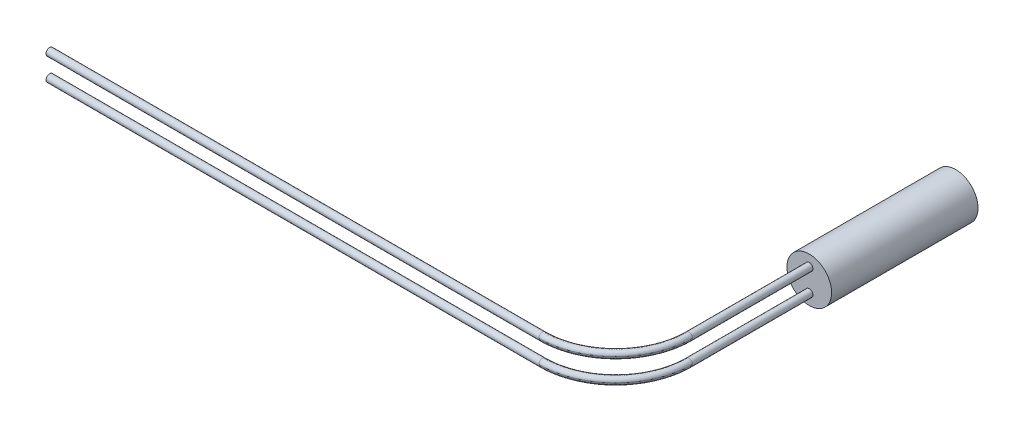
ISO-10303-21;
HEADER;
FILE_DESCRIPTION(('STEP AP214'),'2;1');
FILE_NAME('part.step','',(''),(''),'','','');
FILE_SCHEMA(('AUTOMOTIVE_DESIGN { 1 0 10303 214 1 1 1 1 }'));
ENDSEC;
DATA;
#1=APPLICATION_CONTEXT('core data for automotive mechanical design processes');
#2=APPLICATION_PROTOCOL_DEFINITION('international standard','automotive_design',2000,#1);
#3=PRODUCT_CONTEXT('',#1,'mechanical');
#4=PRODUCT('Part','Part','',(#3));
#5=PRODUCT_RELATED_PRODUCT_CATEGORY('part','',(#4));
#6=PRODUCT_DEFINITION_FORMATION('','',#4);
#7=PRODUCT_DEFINITION_CONTEXT('part definition',#1,'design');
#8=PRODUCT_DEFINITION('design','',#6,#7);
#9=PRODUCT_DEFINITION_SHAPE('','',#8);
#10=(LENGTH_UNIT() NAMED_UNIT(*) SI_UNIT(.MILLI.,.METRE.));
#11=(NAMED_UNIT(*) PLANE_ANGLE_UNIT() SI_UNIT($,.RADIAN.));
#12=(NAMED_UNIT(*) SI_UNIT($,.STERADIAN.) SOLID_ANGLE_UNIT());
#13=UNCERTAINTY_MEASURE_WITH_UNIT(LENGTH_MEASURE(1.E-05),#10,'distance_accuracy_value','');
#14=(GEOMETRIC_REPRESENTATION_CONTEXT(3) GLOBAL_UNCERTAINTY_ASSIGNED_CONTEXT((#13)) GLOBAL_UNIT_ASSIGNED_CONTEXT((#10,
#11,#12)) REPRESENTATION_CONTEXT('',''));
#15=CARTESIAN_POINT('',(0.,0.,0.));
#16=DIRECTION('',(0.,0.,1.));
#17=DIRECTION('',(1.,0.,0.));
#18=AXIS2_PLACEMENT_3D('',#15,#16,#17);
#19=CARTESIAN_POINT('',(-82.329351944,1.944,25.941827475));
#20=DIRECTION('',(-1.,0.,0.));
#21=DIRECTION('',(0.,0.,1.));
#22=AXIS2_PLACEMENT_3D('',#19,#20,#21);
#23=PLANE('',#22);
#24=CARTESIAN_POINT('',(-82.329351944,2.45000000000012,26.447827475));
#25=DIRECTION('',(-1.,0.,0.));
#26=DIRECTION('',(0.,-1.,0.));
#27=AXIS2_PLACEMENT_3D('',#24,#25,#26);
#28=CIRCLE('',#27,0.5);
#29=CARTESIAN_POINT('',(-82.329351944,1.95000000000012,26.447827475));
#30=VERTEX_POINT('',#29);
#31=EDGE_CURVE('E21',#30,#30,#28,.T.);
#32=ORIENTED_EDGE('',*,*,#31,.T.);
#33=EDGE_LOOP('',(#32));
#34=FACE_BOUND('',#33,.T.);
#35=ADVANCED_FACE('F17',(#34),#23,.T.);
#36=CARTESIAN_POINT('',(-15.,2.45,26.447827475));
#37=DIRECTION('',(-1.,0.,0.));
#38=DIRECTION('',(0.,-1.,0.));
#39=AXIS2_PLACEMENT_3D('',#36,#37,#38);
#40=CYLINDRICAL_SURFACE('',#39,0.5);
#41=ORIENTED_EDGE('',*,*,#31,.F.);
#42=EDGE_LOOP('',(#41));
#43=FACE_BOUND('',#42,.T.);
#44=CARTESIAN_POINT('',(-15.,2.45,26.447827475));
#45=DIRECTION('',(-1.,0.,0.));
#46=DIRECTION('',(0.,-1.,0.));
#47=AXIS2_PLACEMENT_3D('',#44,#45,#46);
#48=CIRCLE('',#47,0.5);
#49=CARTESIAN_POINT('',(-15.,2.44999999948479,25.947827475));
#50=VERTEX_POINT('',#49);
#51=CARTESIAN_POINT('',(-15.,2.44999999958734,26.947827475));
#52=VERTEX_POINT('',#51);
#53=EDGE_CURVE('E65',#50,#52,#48,.F.);
#54=ORIENTED_EDGE('',*,*,#53,.F.);
#55=CARTESIAN_POINT('',(-15.,2.45,26.447827475));
#56=DIRECTION('',(-1.,0.,0.));
#57=DIRECTION('',(0.,0.,1.));
#58=AXIS2_PLACEMENT_3D('',#55,#56,#57);
#59=CIRCLE('',#58,0.5);
#60=EDGE_CURVE('E69',#52,#50,#59,.F.);
#61=ORIENTED_EDGE('',*,*,#60,.F.);
#62=EDGE_LOOP('',(#54,#61));
#63=FACE_BOUND('',#62,.T.);
#64=ADVANCED_FACE('F102',(#43,#63),#40,.T.);
#65=CARTESIAN_POINT('',(-4.502497917,2.400083292,16.447827475));
#66=CARTESIAN_POINT('',(-4.502497917,2.400083292,22.597121824));
#67=CARTESIAN_POINT('',(-8.850705651,2.400083292,26.945329557));
#68=CARTESIAN_POINT('',(-15.,2.400083292,26.945329557));
#69=CARTESIAN_POINT('',(-4.470883798,2.71516998,16.447827475));
#70=CARTESIAN_POINT('',(-4.470883798,2.71516998,22.615640946));
#71=CARTESIAN_POINT('',(-8.832186529,2.71516998,26.976943677));
#72=CARTESIAN_POINT('',(-15.,2.71516998,26.976943677));
#73=CARTESIAN_POINT('',(-4.683331287,2.95,16.447827475));
#74=CARTESIAN_POINT('',(-4.683331287,2.95,22.491192088));
#75=CARTESIAN_POINT('',(-8.956635386,2.95,26.764496188));
#76=CARTESIAN_POINT('',(-15.,2.95,26.764496188));
#77=CARTESIAN_POINT('',(-5.,2.95,16.447827475));
#78=CARTESIAN_POINT('',(-5.,2.95,22.305691851));
#79=CARTESIAN_POINT('',(-9.142135624,2.95,26.447827475));
#80=CARTESIAN_POINT('',(-15.,2.95,26.447827475));
#81=CARTESIAN_POINT('',(-5.316668713,2.95,16.447827475));
#82=CARTESIAN_POINT('',(-5.316668713,2.95,22.120191614));
#83=CARTESIAN_POINT('',(-9.327635861,2.95,26.131158762));
#84=CARTESIAN_POINT('',(-15.,2.95,26.131158762));
#85=CARTESIAN_POINT('',(-5.529116202,2.71516998,16.447827475));
#86=CARTESIAN_POINT('',(-5.529116202,2.71516998,21.995742756));
#87=CARTESIAN_POINT('',(-9.452084719,2.71516998,25.918711273));
#88=CARTESIAN_POINT('',(-15.,2.71516998,25.918711273));
#89=CARTESIAN_POINT('',(-5.497502083,2.400083292,16.447827475));
#90=CARTESIAN_POINT('',(-5.497502083,2.400083292,22.014261878));
#91=CARTESIAN_POINT('',(-9.433565596,2.400083292,25.950325392));
#92=CARTESIAN_POINT('',(-15.,2.400083292,25.950325392));
#93=(BOUNDED_SURFACE() B_SPLINE_SURFACE(3,3,((#65,#66,#67,#68),(#69,#70,#71,#72),(#73,#74,#75,
#76),(#77,#78,#79,#80),(#81,#82,#83,#84),(#85,#86,#87,#88),(#89,#90,#91,#92)),.UNSPECIFIED.,.F.,
.F.,.F.) B_SPLINE_SURFACE_WITH_KNOTS((4,3,4),(4,4),(0.,0.5,1.),(0.,1.),
.UNSPECIFIED.) GEOMETRIC_REPRESENTATION_ITEM() RATIONAL_B_SPLINE_SURFACE(((1.,0.804737854124362,
0.804737854124362,1.),(0.780588314885162,0.628168965475237,0.628168965475237,0.780588314885162),
(0.780588314885162,0.628168965475237,0.628168965475237,0.780588314885162),(1.,0.804737854124362,
0.804737854124362,1.),(0.780588314885162,0.628168965475237,0.628168965475237,0.780588314885162),
(0.780588314885162,0.628168965475237,0.628168965475237,0.780588314885162),(1.,0.804737854124362,
0.804737854124362,1.))) REPRESENTATION_ITEM('') SURFACE());
#94=CARTESIAN_POINT('',(-15.,2.44999999917468,16.447827475));
#95=DIRECTION('',(0.,1.,0.));
#96=DIRECTION('',(0.,0.,1.));
#97=AXIS2_PLACEMENT_3D('',#94,#95,#96);
#98=CIRCLE('',#97,9.49999999972375);
#99=CARTESIAN_POINT('',(-5.50000000013812,2.44999999958734,16.447827475));
#100=VERTEX_POINT('',#99);
#101=EDGE_CURVE('E61',#50,#100,#98,.T.);
#102=CARTESIAN_POINT('',(-15.,2.44999999917468,16.447827475));
#103=DIRECTION('',(0.,-1.,0.));
#104=DIRECTION('',(0.,0.,-1.));
#105=AXIS2_PLACEMENT_3D('',#102,#103,#104);
#106=CIRCLE('',#105,10.4999999998516);
#107=CARTESIAN_POINT('',(-4.50000000007418,2.44999999948479,16.447827475));
#108=VERTEX_POINT('',#107);
#109=EDGE_CURVE('E63',#108,#52,#106,.T.);
#110=CARTESIAN_POINT('',(-5.,2.45,16.447827475));
#111=DIRECTION('',(0.,0.,-1.));
#112=DIRECTION('',(-1.,0.,0.));
#113=AXIS2_PLACEMENT_3D('',#110,#111,#112);
#114=CIRCLE('',#113,0.5);
#115=EDGE_CURVE('E53',#108,#100,#114,.F.);
#116=ORIENTED_EDGE('',*,*,#101,.F.);
#117=ORIENTED_EDGE('',*,*,#53,.T.);
#118=ORIENTED_EDGE('',*,*,#109,.F.);
#119=ORIENTED_EDGE('',*,*,#115,.T.);
#120=EDGE_LOOP('',(#116,#117,#118,#119));
#121=FACE_BOUND('',#120,.T.);
#122=ADVANCED_FACE('F59',(#121),#93,.T.);
#123=CARTESIAN_POINT('',(-5.497502083,2.499916708,16.447827475));
#124=CARTESIAN_POINT('',(-5.497502083,2.499916708,22.014261878));
#125=CARTESIAN_POINT('',(-9.433565596,2.499916708,25.950325392));
#126=CARTESIAN_POINT('',(-15.,2.499916708,25.950325392));
#127=CARTESIAN_POINT('',(-5.529116202,2.18483002,16.447827475));
#128=CARTESIAN_POINT('',(-5.529116202,2.18483002,21.995742756));
#129=CARTESIAN_POINT('',(-9.452084719,2.18483002,25.918711273));
#130=CARTESIAN_POINT('',(-15.,2.18483002,25.918711273));
#131=CARTESIAN_POINT('',(-5.316668713,1.95,16.447827475));
#132=CARTESIAN_POINT('',(-5.316668713,1.95,22.120191614));
#133=CARTESIAN_POINT('',(-9.327635861,1.95,26.131158762));
#134=CARTESIAN_POINT('',(-15.,1.95,26.131158762));
#135=CARTESIAN_POINT('',(-5.,1.95,16.447827475));
#136=CARTESIAN_POINT('',(-5.,1.95,22.305691851));
#137=CARTESIAN_POINT('',(-9.142135624,1.95,26.447827475));
#138=CARTESIAN_POINT('',(-15.,1.95,26.447827475));
#139=CARTESIAN_POINT('',(-4.683331287,1.95,16.447827475));
#140=CARTESIAN_POINT('',(-4.683331287,1.95,22.491192088));
#141=CARTESIAN_POINT('',(-8.956635386,1.95,26.764496188));
#142=CARTESIAN_POINT('',(-15.,1.95,26.764496188));
#143=CARTESIAN_POINT('',(-4.470883798,2.18483002,16.447827475));
#144=CARTESIAN_POINT('',(-4.470883798,2.18483002,22.615640946));
#145=CARTESIAN_POINT('',(-8.832186529,2.18483002,26.976943677));
#146=CARTESIAN_POINT('',(-15.,2.18483002,26.976943677));
#147=CARTESIAN_POINT('',(-4.502497917,2.499916708,16.447827475));
#148=CARTESIAN_POINT('',(-4.502497917,2.499916708,22.597121824));
#149=CARTESIAN_POINT('',(-8.850705651,2.499916708,26.945329557));
#150=CARTESIAN_POINT('',(-15.,2.499916708,26.945329557));
#151=(BOUNDED_SURFACE() B_SPLINE_SURFACE(3,3,((#123,#124,#125,#126),(#127,#128,#129,#130),(#131,
#132,#133,#134),(#135,#136,#137,#138),(#139,#140,#141,#142),(#143,#144,#145,#146),(#147,#148,
#149,#150)),.UNSPECIFIED.,.F.,.F.,.F.) B_SPLINE_SURFACE_WITH_KNOTS((4,3,4),(4,4),(0.,0.5,1.),
(0.,1.),.UNSPECIFIED.) GEOMETRIC_REPRESENTATION_ITEM() RATIONAL_B_SPLINE_SURFACE(((1.,
0.804737854124362,0.804737854124362,1.),(0.780588314885162,0.628168965475237,0.628168965475237,
0.780588314885162),(0.780588314885162,0.628168965475237,0.628168965475237,0.780588314885162),
(1.,0.804737854124362,0.804737854124362,1.),(0.780588314885162,0.628168965475237,
0.628168965475237,0.780588314885162),(0.780588314885162,0.628168965475237,0.628168965475237,
0.780588314885162),(1.,0.804737854124362,0.804737854124362,1.))) REPRESENTATION_ITEM('') SURFACE());
#152=CARTESIAN_POINT('',(-5.,2.45,16.447827475));
#153=DIRECTION('',(0.,0.,-1.));
#154=DIRECTION('',(-1.,0.,0.));
#155=AXIS2_PLACEMENT_3D('',#152,#153,#154);
#156=CIRCLE('',#155,0.5);
#157=EDGE_CURVE('E68',#100,#108,#156,.F.);
#158=ORIENTED_EDGE('',*,*,#60,.T.);
#159=ORIENTED_EDGE('',*,*,#101,.T.);
#160=ORIENTED_EDGE('',*,*,#157,.T.);
#161=ORIENTED_EDGE('',*,*,#109,.T.);
#162=EDGE_LOOP('',(#158,#159,#160,#161));
#163=FACE_BOUND('',#162,.T.);
#164=ADVANCED_FACE('F67',(#163),#151,.T.);
#165=CARTESIAN_POINT('',(-8.0866,0.9134,-20.));
#166=DIRECTION('',(0.,0.,1.));
#167=DIRECTION('',(1.,0.,0.));
#168=AXIS2_PLACEMENT_3D('',#165,#166,#167);
#169=PLANE('',#168);
#170=CARTESIAN_POINT('',(-5.,4.,-20.));
#171=DIRECTION('',(0.,0.,1.));
#172=DIRECTION('',(0.,-1.,0.));
#173=AXIS2_PLACEMENT_3D('',#170,#171,#172);
#174=CIRCLE('',#173,3.05);
#175=CARTESIAN_POINT('',(-5.,0.95,-20.));
#176=VERTEX_POINT('',#175);
#177=EDGE_CURVE('E73',#176,#176,#174,.F.);
#178=ORIENTED_EDGE('',*,*,#177,.T.);
#179=EDGE_LOOP('',(#178));
#180=FACE_BOUND('',#179,.T.);
#181=ADVANCED_FACE('F154',(#180),#169,.F.);
#182=CARTESIAN_POINT('',(-5.,4.,-20.));
#183=DIRECTION('',(0.,0.,1.));
#184=DIRECTION('',(0.,-1.,0.));
#185=AXIS2_PLACEMENT_3D('',#182,#183,#184);
#186=CYLINDRICAL_SURFACE('',#185,3.05);
#187=ORIENTED_EDGE('',*,*,#177,.F.);
#188=EDGE_LOOP('',(#187));
#189=FACE_BOUND('',#188,.T.);
#190=CARTESIAN_POINT('',(-5.,3.99999999999999,0.));
#191=DIRECTION('',(0.,0.,1.));
#192=DIRECTION('',(0.,-1.,0.));
#193=AXIS2_PLACEMENT_3D('',#190,#191,#192);
#194=CIRCLE('',#193,3.05);
#195=CARTESIAN_POINT('',(-5.,0.949999999999989,0.));
#196=VERTEX_POINT('',#195);
#197=EDGE_CURVE('E98',#196,#196,#194,.T.);
#198=ORIENTED_EDGE('',*,*,#197,.F.);
#199=EDGE_LOOP('',(#198));
#200=FACE_BOUND('',#199,.T.);
#201=ADVANCED_FACE('F150',(#189,#200),#186,.T.);
#202=CARTESIAN_POINT('',(-5.,2.45,16.447827475));
#203=DIRECTION('',(0.,0.,-1.));
#204=DIRECTION('',(-1.,0.,0.));
#205=AXIS2_PLACEMENT_3D('',#202,#203,#204);
#206=CYLINDRICAL_SURFACE('',#205,0.5);
#207=CARTESIAN_POINT('',(-5.,2.45,0.));
#208=DIRECTION('',(0.,0.,-1.));
#209=DIRECTION('',(-1.,0.,0.));
#210=AXIS2_PLACEMENT_3D('',#207,#208,#209);
#211=CIRCLE('',#210,0.5);
#212=CARTESIAN_POINT('',(-5.5,2.45,0.));
#213=VERTEX_POINT('',#212);
#214=EDGE_CURVE('E95',#213,#213,#211,.T.);
#215=ORIENTED_EDGE('',*,*,#214,.F.);
#216=EDGE_LOOP('',(#215));
#217=FACE_BOUND('',#216,.T.);
#218=ORIENTED_EDGE('',*,*,#115,.F.);
#219=ORIENTED_EDGE('',*,*,#157,.F.);
#220=EDGE_LOOP('',(#218,#219));
#221=FACE_BOUND('',#220,.T.);
#222=ADVANCED_FACE('F72',(#217,#221),#206,.T.);
#223=CARTESIAN_POINT('',(-82.329351944,5.044,25.941827475));
#224=DIRECTION('',(-1.,0.,0.));
#225=DIRECTION('',(0.,0.,1.));
#226=AXIS2_PLACEMENT_3D('',#223,#224,#225);
#227=PLANE('',#226);
#228=CARTESIAN_POINT('',(-82.329351944,5.55000000000012,26.447827475));
#229=DIRECTION('',(-1.,0.,0.));
#230=DIRECTION('',(0.,-1.,0.));
#231=AXIS2_PLACEMENT_3D('',#228,#229,#230);
#232=CIRCLE('',#231,0.5);
#233=CARTESIAN_POINT('',(-82.329351944,5.05000000000012,26.447827475));
#234=VERTEX_POINT('',#233);
#235=EDGE_CURVE('E91',#234,#234,#232,.T.);
#236=ORIENTED_EDGE('',*,*,#235,.T.);
#237=EDGE_LOOP('',(#236));
#238=FACE_BOUND('',#237,.T.);
#239=ADVANCED_FACE('F149',(#238),#227,.T.);
#240=CARTESIAN_POINT('',(-8.0866,0.9134,0.));
#241=DIRECTION('',(0.,0.,1.));
#242=DIRECTION('',(1.,0.,0.));
#243=AXIS2_PLACEMENT_3D('',#240,#241,#242);
#244=PLANE('',#243);
#245=ORIENTED_EDGE('',*,*,#214,.T.);
#246=EDGE_LOOP('',(#245));
#247=FACE_BOUND('',#246,.T.);
#248=CARTESIAN_POINT('',(-5.,5.55,0.));
#249=DIRECTION('',(0.,0.,-1.));
#250=DIRECTION('',(-1.,0.,0.));
#251=AXIS2_PLACEMENT_3D('',#248,#249,#250);
#252=CIRCLE('',#251,0.5);
#253=CARTESIAN_POINT('',(-5.5,5.55,0.));
#254=VERTEX_POINT('',#253);
#255=EDGE_CURVE('E88',#254,#254,#252,.T.);
#256=ORIENTED_EDGE('',*,*,#255,.T.);
#257=EDGE_LOOP('',(#256));
#258=FACE_BOUND('',#257,.T.);
#259=ORIENTED_EDGE('',*,*,#197,.T.);
#260=EDGE_LOOP('',(#259));
#261=FACE_BOUND('',#260,.T.);
#262=ADVANCED_FACE('F19',(#247,#258,#261),#244,.T.);
#263=CARTESIAN_POINT('',(-15.,5.55,26.447827475));
#264=DIRECTION('',(-1.,0.,0.));
#265=DIRECTION('',(0.,-1.,0.));
#266=AXIS2_PLACEMENT_3D('',#263,#264,#265);
#267=CYLINDRICAL_SURFACE('',#266,0.5);
#268=ORIENTED_EDGE('',*,*,#235,.F.);
#269=EDGE_LOOP('',(#268));
#270=FACE_BOUND('',#269,.T.);
#271=CARTESIAN_POINT('',(-15.,5.55,26.447827475));
#272=DIRECTION('',(-1.,0.,0.));
#273=DIRECTION('',(0.,-1.,0.));
#274=AXIS2_PLACEMENT_3D('',#271,#272,#273);
#275=CIRCLE('',#274,0.5);
#276=CARTESIAN_POINT('',(-15.,5.54999999948479,25.947827475));
#277=VERTEX_POINT('',#276);
#278=CARTESIAN_POINT('',(-15.,5.54999999958734,26.947827475));
#279=VERTEX_POINT('',#278);
#280=EDGE_CURVE('E85',#277,#279,#275,.F.);
#281=ORIENTED_EDGE('',*,*,#280,.F.);
#282=CARTESIAN_POINT('',(-15.,5.55,26.447827475));
#283=DIRECTION('',(-1.,0.,0.));
#284=DIRECTION('',(0.,0.,1.));
#285=AXIS2_PLACEMENT_3D('',#282,#283,#284);
#286=CIRCLE('',#285,0.5);
#287=EDGE_CURVE('E35',#279,#277,#286,.F.);
#288=ORIENTED_EDGE('',*,*,#287,.F.);
#289=EDGE_LOOP('',(#281,#288));
#290=FACE_BOUND('',#289,.T.);
#291=ADVANCED_FACE('F142',(#270,#290),#267,.T.);
#292=CARTESIAN_POINT('',(-5.,5.55,16.447827475));
#293=DIRECTION('',(0.,0.,-1.));
#294=DIRECTION('',(-1.,0.,0.));
#295=AXIS2_PLACEMENT_3D('',#292,#293,#294);
#296=CYLINDRICAL_SURFACE('',#295,0.5);
#297=CARTESIAN_POINT('',(-5.,5.55,16.447827475));
#298=DIRECTION('',(0.,0.,-1.));
#299=DIRECTION('',(-1.,0.,0.));
#300=AXIS2_PLACEMENT_3D('',#297,#298,#299);
#301=CIRCLE('',#300,0.5);
#302=CARTESIAN_POINT('',(-5.5,5.54999999958734,16.447827475));
#303=VERTEX_POINT('',#302);
#304=CARTESIAN_POINT('',(-4.50000000007418,5.54999999948479,16.447827475));
#305=VERTEX_POINT('',#304);
#306=EDGE_CURVE('E82',#303,#305,#301,.F.);
#307=ORIENTED_EDGE('',*,*,#306,.F.);
#308=CARTESIAN_POINT('',(-5.,5.55,16.447827475));
#309=DIRECTION('',(0.,0.,-1.));
#310=DIRECTION('',(-1.,0.,0.));
#311=AXIS2_PLACEMENT_3D('',#308,#309,#310);
#312=CIRCLE('',#311,0.5);
#313=EDGE_CURVE('E94',#305,#303,#312,.F.);
#314=ORIENTED_EDGE('',*,*,#313,.F.);
#315=EDGE_LOOP('',(#307,#314));
#316=FACE_BOUND('',#315,.T.);
#317=ORIENTED_EDGE('',*,*,#255,.F.);
#318=EDGE_LOOP('',(#317));
#319=FACE_BOUND('',#318,.T.);
#320=ADVANCED_FACE('F122',(#316,#319),#296,.T.);
#321=CARTESIAN_POINT('',(-4.502497917,5.500083292,16.447827475));
#322=CARTESIAN_POINT('',(-4.502497917,5.500083292,22.597121824));
#323=CARTESIAN_POINT('',(-8.850705651,5.500083292,26.945329557));
#324=CARTESIAN_POINT('',(-15.,5.500083292,26.945329557));
#325=CARTESIAN_POINT('',(-4.470883798,5.81516998,16.447827475));
#326=CARTESIAN_POINT('',(-4.470883798,5.81516998,22.615640946));
#327=CARTESIAN_POINT('',(-8.832186529,5.81516998,26.976943677));
#328=CARTESIAN_POINT('',(-15.,5.81516998,26.976943677));
#329=CARTESIAN_POINT('',(-4.683331287,6.05,16.447827475));
#330=CARTESIAN_POINT('',(-4.683331287,6.05,22.491192088));
#331=CARTESIAN_POINT('',(-8.956635386,6.05,26.764496188));
#332=CARTESIAN_POINT('',(-15.,6.05,26.764496188));
#333=CARTESIAN_POINT('',(-5.,6.05,16.447827475));
#334=CARTESIAN_POINT('',(-5.,6.05,22.305691851));
#335=CARTESIAN_POINT('',(-9.142135624,6.05,26.447827475));
#336=CARTESIAN_POINT('',(-15.,6.05,26.447827475));
#337=CARTESIAN_POINT('',(-5.316668713,6.05,16.447827475));
#338=CARTESIAN_POINT('',(-5.316668713,6.05,22.120191614));
#339=CARTESIAN_POINT('',(-9.327635861,6.05,26.131158762));
#340=CARTESIAN_POINT('',(-15.,6.05,26.131158762));
#341=CARTESIAN_POINT('',(-5.529116202,5.81516998,16.447827475));
#342=CARTESIAN_POINT('',(-5.529116202,5.81516998,21.995742756));
#343=CARTESIAN_POINT('',(-9.452084719,5.81516998,25.918711273));
#344=CARTESIAN_POINT('',(-15.,5.81516998,25.918711273));
#345=CARTESIAN_POINT('',(-5.497502083,5.500083292,16.447827475));
#346=CARTESIAN_POINT('',(-5.497502083,5.500083292,22.014261878));
#347=CARTESIAN_POINT('',(-9.433565596,5.500083292,25.950325392));
#348=CARTESIAN_POINT('',(-15.,5.500083292,25.950325392));
#349=(BOUNDED_SURFACE() B_SPLINE_SURFACE(3,3,((#321,#322,#323,#324),(#325,#326,#327,#328),(#329,
#330,#331,#332),(#333,#334,#335,#336),(#337,#338,#339,#340),(#341,#342,#343,#344),(#345,#346,
#347,#348)),.UNSPECIFIED.,.F.,.F.,.F.) B_SPLINE_SURFACE_WITH_KNOTS((4,3,4),(4,4),(0.,0.5,1.),
(0.,1.),.UNSPECIFIED.) GEOMETRIC_REPRESENTATION_ITEM() RATIONAL_B_SPLINE_SURFACE(((1.,
0.804737854124362,0.804737854124362,1.),(0.780588314885162,0.628168965475237,0.628168965475237,
0.780588314885162),(0.780588314885162,0.628168965475237,0.628168965475237,0.780588314885162),
(1.,0.804737854124362,0.804737854124362,1.),(0.780588314885162,0.628168965475237,
0.628168965475237,0.780588314885162),(0.780588314885162,0.628168965475237,0.628168965475237,
0.780588314885162),(1.,0.804737854124362,0.804737854124362,1.))) REPRESENTATION_ITEM('') SURFACE());
#350=CARTESIAN_POINT('',(-15.,5.54999999917468,16.447827475));
#351=DIRECTION('',(0.,1.,0.));
#352=DIRECTION('',(0.,0.,1.));
#353=AXIS2_PLACEMENT_3D('',#350,#351,#352);
#354=CIRCLE('',#353,9.49999999972375);
#355=EDGE_CURVE('E11',#277,#303,#354,.T.);
#356=CARTESIAN_POINT('',(-15.,5.54999999917468,16.447827475));
#357=DIRECTION('',(0.,-1.,0.));
#358=DIRECTION('',(0.,0.,-1.));
#359=AXIS2_PLACEMENT_3D('',#356,#357,#358);
#360=CIRCLE('',#359,10.4999999998516);
#361=EDGE_CURVE('E27',#305,#279,#360,.T.);
#362=ORIENTED_EDGE('',*,*,#355,.F.);
#363=ORIENTED_EDGE('',*,*,#280,.T.);
#364=ORIENTED_EDGE('',*,*,#361,.F.);
#365=ORIENTED_EDGE('',*,*,#313,.T.);
#366=EDGE_LOOP('',(#362,#363,#364,#365));
#367=FACE_BOUND('',#366,.T.);
#368=ADVANCED_FACE('F117',(#367),#349,.T.);
#369=CARTESIAN_POINT('',(-5.497502083,5.599916708,16.447827475));
#370=CARTESIAN_POINT('',(-5.497502083,5.599916708,22.014261878));
#371=CARTESIAN_POINT('',(-9.433565596,5.599916708,25.950325392));
#372=CARTESIAN_POINT('',(-15.,5.599916708,25.950325392));
#373=CARTESIAN_POINT('',(-5.529116202,5.28483002,16.447827475));
#374=CARTESIAN_POINT('',(-5.529116202,5.28483002,21.995742756));
#375=CARTESIAN_POINT('',(-9.452084719,5.28483002,25.918711273));
#376=CARTESIAN_POINT('',(-15.,5.28483002,25.918711273));
#377=CARTESIAN_POINT('',(-5.316668713,5.05,16.447827475));
#378=CARTESIAN_POINT('',(-5.316668713,5.05,22.120191614));
#379=CARTESIAN_POINT('',(-9.327635861,5.05,26.131158762));
#380=CARTESIAN_POINT('',(-15.,5.05,26.131158762));
#381=CARTESIAN_POINT('',(-5.,5.05,16.447827475));
#382=CARTESIAN_POINT('',(-5.,5.05,22.305691851));
#383=CARTESIAN_POINT('',(-9.142135624,5.05,26.447827475));
#384=CARTESIAN_POINT('',(-15.,5.05,26.447827475));
#385=CARTESIAN_POINT('',(-4.683331287,5.05,16.447827475));
#386=CARTESIAN_POINT('',(-4.683331287,5.05,22.491192088));
#387=CARTESIAN_POINT('',(-8.956635386,5.05,26.764496188));
#388=CARTESIAN_POINT('',(-15.,5.05,26.764496188));
#389=CARTESIAN_POINT('',(-4.470883798,5.28483002,16.447827475));
#390=CARTESIAN_POINT('',(-4.470883798,5.28483002,22.615640946));
#391=CARTESIAN_POINT('',(-8.832186529,5.28483002,26.976943677));
#392=CARTESIAN_POINT('',(-15.,5.28483002,26.976943677));
#393=CARTESIAN_POINT('',(-4.502497917,5.599916708,16.447827475));
#394=CARTESIAN_POINT('',(-4.502497917,5.599916708,22.597121824));
#395=CARTESIAN_POINT('',(-8.850705651,5.599916708,26.945329557));
#396=CARTESIAN_POINT('',(-15.,5.599916708,26.945329557));
#397=(BOUNDED_SURFACE() B_SPLINE_SURFACE(3,3,((#369,#370,#371,#372),(#373,#374,#375,#376),(#377,
#378,#379,#380),(#381,#382,#383,#384),(#385,#386,#387,#388),(#389,#390,#391,#392),(#393,#394,
#395,#396)),.UNSPECIFIED.,.F.,.F.,.F.) B_SPLINE_SURFACE_WITH_KNOTS((4,3,4),(4,4),(0.,0.5,1.),
(0.,1.),.UNSPECIFIED.) GEOMETRIC_REPRESENTATION_ITEM() RATIONAL_B_SPLINE_SURFACE(((1.,
0.804737854124362,0.804737854124362,1.),(0.780588314885162,0.628168965475237,0.628168965475237,
0.780588314885162),(0.780588314885162,0.628168965475237,0.628168965475237,0.780588314885162),
(1.,0.804737854124362,0.804737854124362,1.),(0.780588314885162,0.628168965475237,
0.628168965475237,0.780588314885162),(0.780588314885162,0.628168965475237,0.628168965475237,
0.780588314885162),(1.,0.804737854124362,0.804737854124362,1.))) REPRESENTATION_ITEM('') SURFACE());
#398=ORIENTED_EDGE('',*,*,#287,.T.);
#399=ORIENTED_EDGE('',*,*,#355,.T.);
#400=ORIENTED_EDGE('',*,*,#306,.T.);
#401=ORIENTED_EDGE('',*,*,#361,.T.);
#402=EDGE_LOOP('',(#398,#399,#400,#401));
#403=FACE_BOUND('',#402,.T.);
#404=ADVANCED_FACE('F115',(#403),#397,.T.);
#405=CLOSED_SHELL('',(#35,#64,#122,#164,#181,#201,#222,#239,#262,#291,#320,#368,#404));
#406=MANIFOLD_SOLID_BREP('B1',#405);
#407=ADVANCED_BREP_SHAPE_REPRESENTATION('',(#18,#406),#14);
#408=SHAPE_DEFINITION_REPRESENTATION(#9,#407);
ENDSEC;
END-ISO-10303-21;
